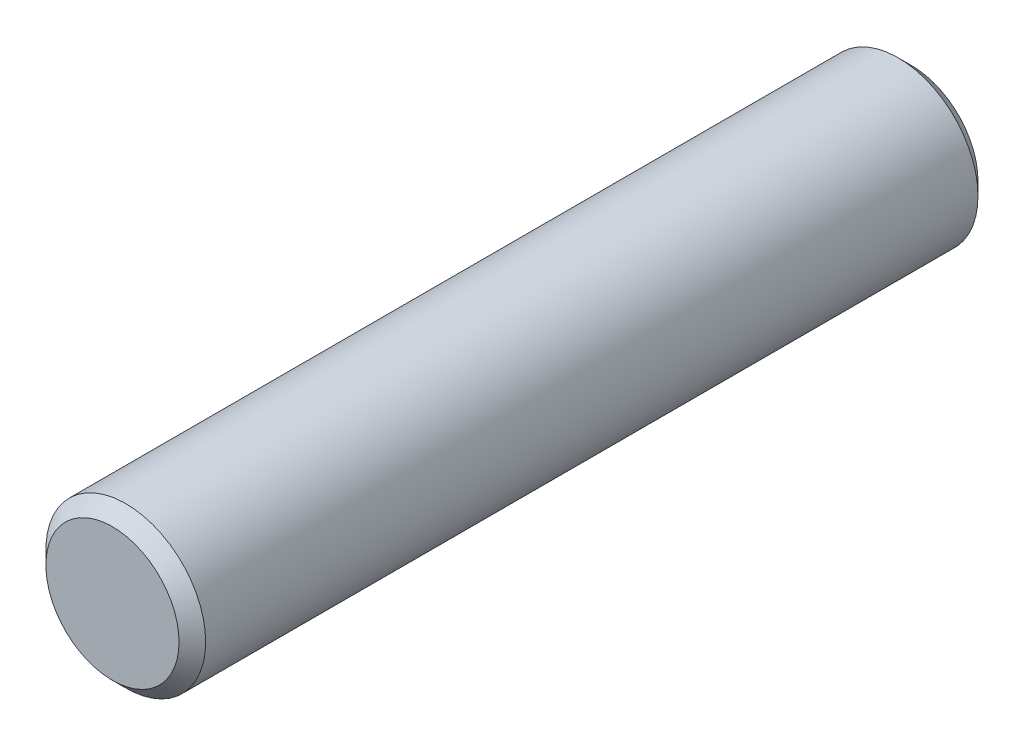
ISO-10303-21;
HEADER;
FILE_DESCRIPTION(('STEP AP214'),'2;1');
FILE_NAME('part.step','',(''),(''),'','','');
FILE_SCHEMA(('AUTOMOTIVE_DESIGN { 1 0 10303 214 1 1 1 1 }'));
ENDSEC;
DATA;
#1=APPLICATION_CONTEXT('core data for automotive mechanical design processes');
#2=APPLICATION_PROTOCOL_DEFINITION('international standard','automotive_design',2000,#1);
#3=PRODUCT_CONTEXT('',#1,'mechanical');
#4=PRODUCT('Part','Part','',(#3));
#5=PRODUCT_RELATED_PRODUCT_CATEGORY('part','',(#4));
#6=PRODUCT_DEFINITION_FORMATION('','',#4);
#7=PRODUCT_DEFINITION_CONTEXT('part definition',#1,'design');
#8=PRODUCT_DEFINITION('design','',#6,#7);
#9=PRODUCT_DEFINITION_SHAPE('','',#8);
#10=(LENGTH_UNIT() NAMED_UNIT(*) SI_UNIT(.MILLI.,.METRE.));
#11=(NAMED_UNIT(*) PLANE_ANGLE_UNIT() SI_UNIT($,.RADIAN.));
#12=(NAMED_UNIT(*) SI_UNIT($,.STERADIAN.) SOLID_ANGLE_UNIT());
#13=UNCERTAINTY_MEASURE_WITH_UNIT(LENGTH_MEASURE(1.E-05),#10,'distance_accuracy_value','');
#14=(GEOMETRIC_REPRESENTATION_CONTEXT(3) GLOBAL_UNCERTAINTY_ASSIGNED_CONTEXT((#13)) GLOBAL_UNIT_ASSIGNED_CONTEXT((#10,
#11,#12)) REPRESENTATION_CONTEXT('',''));
#15=CARTESIAN_POINT('',(0.,0.,0.));
#16=DIRECTION('',(0.,0.,1.));
#17=DIRECTION('',(1.,0.,0.));
#18=AXIS2_PLACEMENT_3D('',#15,#16,#17);
#19=CARTESIAN_POINT('',(0.,0.,15.));
#20=DIRECTION('',(0.,0.,-1.));
#21=DIRECTION('',(-1.,0.,0.));
#22=AXIS2_PLACEMENT_3D('',#19,#20,#21);
#23=CYLINDRICAL_SURFACE('',#22,3.);
#24=CARTESIAN_POINT('',(0.,0.,-14.5));
#25=DIRECTION('',(0.,0.,1.));
#26=DIRECTION('',(1.,0.,0.));
#27=AXIS2_PLACEMENT_3D('',#24,#25,#26);
#28=CIRCLE('',#27,3.);
#29=CARTESIAN_POINT('',(3.,0.,-14.5));
#30=VERTEX_POINT('',#29);
#31=EDGE_CURVE('E53',#30,#30,#28,.T.);
#32=ORIENTED_EDGE('',*,*,#31,.T.);
#33=EDGE_LOOP('',(#32));
#34=FACE_BOUND('',#33,.T.);
#35=CARTESIAN_POINT('',(0.,0.,14.5));
#36=DIRECTION('',(0.,0.,1.));
#37=DIRECTION('',(1.,0.,0.));
#38=AXIS2_PLACEMENT_3D('',#35,#36,#37);
#39=CIRCLE('',#38,3.);
#40=CARTESIAN_POINT('',(3.,0.,14.5));
#41=VERTEX_POINT('',#40);
#42=EDGE_CURVE('E58',#41,#41,#39,.F.);
#43=ORIENTED_EDGE('',*,*,#42,.T.);
#44=EDGE_LOOP('',(#43));
#45=FACE_BOUND('',#44,.T.);
#46=ADVANCED_FACE('F39',(#34,#45),#23,.T.);
#47=CARTESIAN_POINT('',(0.,0.,15.));
#48=DIRECTION('',(0.,0.,1.));
#49=DIRECTION('',(1.,0.,0.));
#50=AXIS2_PLACEMENT_3D('',#47,#48,#49);
#51=PLANE('',#50);
#52=CARTESIAN_POINT('',(0.,0.,15.));
#53=DIRECTION('',(0.,0.,1.));
#54=DIRECTION('',(1.,0.,0.));
#55=AXIS2_PLACEMENT_3D('',#52,#53,#54);
#56=CIRCLE('',#55,2.5);
#57=CARTESIAN_POINT('',(2.5,0.,15.));
#58=VERTEX_POINT('',#57);
#59=EDGE_CURVE('E10',#58,#58,#56,.T.);
#60=ORIENTED_EDGE('',*,*,#59,.T.);
#61=EDGE_LOOP('',(#60));
#62=FACE_BOUND('',#61,.T.);
#63=ADVANCED_FACE('F75',(#62),#51,.T.);
#64=CARTESIAN_POINT('',(0.,0.,-15.));
#65=DIRECTION('',(0.,0.,1.));
#66=DIRECTION('',(1.,0.,0.));
#67=AXIS2_PLACEMENT_3D('',#64,#65,#66);
#68=PLANE('',#67);
#69=CARTESIAN_POINT('',(0.,0.,-15.));
#70=DIRECTION('',(0.,0.,1.));
#71=DIRECTION('',(1.,0.,0.));
#72=AXIS2_PLACEMENT_3D('',#69,#70,#71);
#73=CIRCLE('',#72,2.5);
#74=CARTESIAN_POINT('',(2.5,0.,-15.));
#75=VERTEX_POINT('',#74);
#76=EDGE_CURVE('E48',#75,#75,#73,.F.);
#77=ORIENTED_EDGE('',*,*,#76,.T.);
#78=EDGE_LOOP('',(#77));
#79=FACE_BOUND('',#78,.T.);
#80=ADVANCED_FACE('F72',(#79),#68,.F.);
#81=CARTESIAN_POINT('',(0.,0.,-14.5));
#82=DIRECTION('',(0.,0.,1.));
#83=DIRECTION('',(1.,0.,0.));
#84=AXIS2_PLACEMENT_3D('',#81,#82,#83);
#85=CONICAL_SURFACE('',#84,3.,0.785398163397449);
#86=ORIENTED_EDGE('',*,*,#76,.F.);
#87=EDGE_LOOP('',(#86));
#88=FACE_BOUND('',#87,.T.);
#89=ORIENTED_EDGE('',*,*,#31,.F.);
#90=EDGE_LOOP('',(#89));
#91=FACE_BOUND('',#90,.T.);
#92=ADVANCED_FACE('F68',(#88,#91),#85,.T.);
#93=CARTESIAN_POINT('',(0.,0.,15.));
#94=DIRECTION('',(0.,0.,-1.));
#95=DIRECTION('',(-1.,0.,0.));
#96=AXIS2_PLACEMENT_3D('',#93,#94,#95);
#97=CONICAL_SURFACE('',#96,2.5,0.785398163397445);
#98=ORIENTED_EDGE('',*,*,#42,.F.);
#99=EDGE_LOOP('',(#98));
#100=FACE_BOUND('',#99,.T.);
#101=ORIENTED_EDGE('',*,*,#59,.F.);
#102=EDGE_LOOP('',(#101));
#103=FACE_BOUND('',#102,.T.);
#104=ADVANCED_FACE('F42',(#100,#103),#97,.T.);
#105=CLOSED_SHELL('',(#46,#63,#80,#92,#104));
#106=MANIFOLD_SOLID_BREP('B2',#105);
#107=ADVANCED_BREP_SHAPE_REPRESENTATION('',(#18,#106),#14);
#108=SHAPE_DEFINITION_REPRESENTATION(#9,#107);
ENDSEC;
END-ISO-10303-21;
